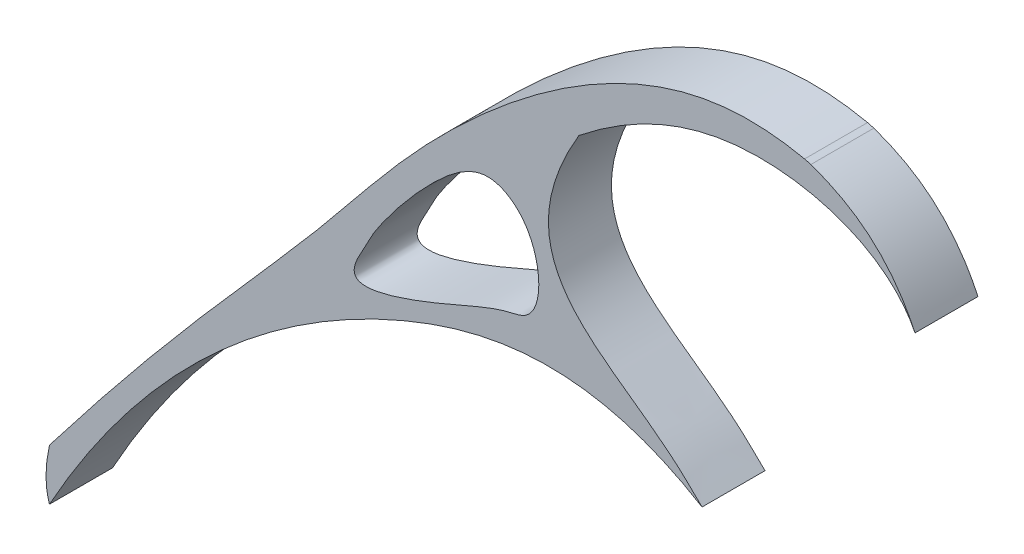
ISO-10303-21;
HEADER;
FILE_DESCRIPTION(('STEP AP214'),'2;1');
FILE_NAME('part.step','',(''),(''),'','','');
FILE_SCHEMA(('AUTOMOTIVE_DESIGN { 1 0 10303 214 1 1 1 1 }'));
ENDSEC;
DATA;
#1=APPLICATION_CONTEXT('core data for automotive mechanical design processes');
#2=APPLICATION_PROTOCOL_DEFINITION('international standard','automotive_design',2000,#1);
#3=PRODUCT_CONTEXT('',#1,'mechanical');
#4=PRODUCT('Part','Part','',(#3));
#5=PRODUCT_RELATED_PRODUCT_CATEGORY('part','',(#4));
#6=PRODUCT_DEFINITION_FORMATION('','',#4);
#7=PRODUCT_DEFINITION_CONTEXT('part definition',#1,'design');
#8=PRODUCT_DEFINITION('design','',#6,#7);
#9=PRODUCT_DEFINITION_SHAPE('','',#8);
#10=(LENGTH_UNIT() NAMED_UNIT(*) SI_UNIT(.MILLI.,.METRE.));
#11=(NAMED_UNIT(*) PLANE_ANGLE_UNIT() SI_UNIT($,.RADIAN.));
#12=(NAMED_UNIT(*) SI_UNIT($,.STERADIAN.) SOLID_ANGLE_UNIT());
#13=UNCERTAINTY_MEASURE_WITH_UNIT(LENGTH_MEASURE(1.E-05),#10,'distance_accuracy_value','');
#14=(GEOMETRIC_REPRESENTATION_CONTEXT(3) GLOBAL_UNCERTAINTY_ASSIGNED_CONTEXT((#13)) GLOBAL_UNIT_ASSIGNED_CONTEXT((#10,
#11,#12)) REPRESENTATION_CONTEXT('',''));
#15=CARTESIAN_POINT('',(0.,0.,0.));
#16=DIRECTION('',(0.,0.,1.));
#17=DIRECTION('',(1.,0.,0.));
#18=AXIS2_PLACEMENT_3D('',#15,#16,#17);
#19=CARTESIAN_POINT('',(2.78157023495851,56.4778755727566,10.));
#20=CARTESIAN_POINT('',(-10.9181701920679,33.3522717841158,10.));
#21=CARTESIAN_POINT('',(9.37374892165481,28.4412942857522,10.));
#22=CARTESIAN_POINT('',(21.2758968242971,16.1363417375195,10.));
#23=CARTESIAN_POINT('',(22.3295883280873,15.1510013995163,10.));
#24=B_SPLINE_CURVE_WITH_KNOTS('',3,(#19,#20,#21,#22,#23),.UNSPECIFIED.,.F.,.F.,(4,1,4),(0.,
0.747546219200271,0.818239289465083),.UNSPECIFIED.);
#25=DIRECTION('',(0.,0.,-1.));
#26=VECTOR('',#25,1.);
#27=SURFACE_OF_LINEAR_EXTRUSION('',#24,#26);
#28=CARTESIAN_POINT('',(2.78157023495851,56.4778755727566,0.));
#29=CARTESIAN_POINT('',(-10.9181701920679,33.3522717841158,0.));
#30=CARTESIAN_POINT('',(9.37374892165481,28.4412942857522,0.));
#31=CARTESIAN_POINT('',(21.2758968242971,16.1363417375195,0.));
#32=CARTESIAN_POINT('',(22.3295883280873,15.1510013995163,0.));
#33=B_SPLINE_CURVE_WITH_KNOTS('',3,(#28,#29,#30,#31,#32),.UNSPECIFIED.,.F.,.F.,(4,1,4),(0.,
0.747546219200271,0.818239289465083),.UNSPECIFIED.);
#34=CARTESIAN_POINT('',(2.78157023495851,56.4778755727566,0.));
#35=VERTEX_POINT('',#34);
#36=CARTESIAN_POINT('',(22.3295883280881,15.1510013995158,0.));
#37=VERTEX_POINT('',#36);
#38=EDGE_CURVE('E192',#35,#37,#33,.T.);
#39=ORIENTED_EDGE('',*,*,#38,.F.);
#40=DIRECTION('',(0.,0.,-1.));
#41=VECTOR('',#40,1.);
#42=CARTESIAN_POINT('',(2.78157023495851,56.4778755727566,10.));
#43=LINE('',#42,#41);
#44=CARTESIAN_POINT('',(2.78157023495851,56.4778755727566,10.));
#45=VERTEX_POINT('',#44);
#46=EDGE_CURVE('E11',#45,#35,#43,.T.);
#47=ORIENTED_EDGE('',*,*,#46,.F.);
#48=CARTESIAN_POINT('',(22.3295883280881,15.1510013995158,10.));
#49=VERTEX_POINT('',#48);
#50=EDGE_CURVE('E169',#45,#49,#24,.T.);
#51=ORIENTED_EDGE('',*,*,#50,.T.);
#52=DIRECTION('',(0.,0.,-1.));
#53=VECTOR('',#52,1.);
#54=CARTESIAN_POINT('',(22.3295883280881,15.1510013995158,10.));
#55=LINE('',#54,#53);
#56=EDGE_CURVE('E83',#49,#37,#55,.T.);
#57=ORIENTED_EDGE('',*,*,#56,.T.);
#58=EDGE_LOOP('',(#39,#47,#51,#57));
#59=FACE_BOUND('',#58,.T.);
#60=ADVANCED_FACE('F34',(#59),#27,.T.);
#61=CARTESIAN_POINT('',(2.78157023495851,56.4778755727566,10.));
#62=CARTESIAN_POINT('',(9.75505173456173,62.0195083270774,10.));
#63=CARTESIAN_POINT('',(27.3967479811564,71.9932714494888,10.));
#64=CARTESIAN_POINT('',(52.444202769317,64.8941986857287,10.));
#65=CARTESIAN_POINT('',(56.5463486284125,55.127707577663,10.));
#66=B_SPLINE_CURVE_WITH_KNOTS('',3,(#61,#62,#63,#64,#65),.UNSPECIFIED.,.F.,.F.,(4,1,4),(0.,
0.46260532823252,1.),.UNSPECIFIED.);
#67=DIRECTION('',(0.,0.,-1.));
#68=VECTOR('',#67,1.);
#69=SURFACE_OF_LINEAR_EXTRUSION('',#66,#68);
#70=CARTESIAN_POINT('',(2.78157023495851,56.4778755727566,0.));
#71=CARTESIAN_POINT('',(9.75505173456173,62.0195083270774,0.));
#72=CARTESIAN_POINT('',(27.3967479811564,71.9932714494888,0.));
#73=CARTESIAN_POINT('',(52.444202769317,64.8941986857287,0.));
#74=CARTESIAN_POINT('',(56.5463486284125,55.127707577663,0.));
#75=B_SPLINE_CURVE_WITH_KNOTS('',3,(#70,#71,#72,#73,#74),.UNSPECIFIED.,.F.,.F.,(4,1,4),(0.,
0.46260532823252,1.),.UNSPECIFIED.);
#76=CARTESIAN_POINT('',(56.1462722876943,56.0026222725463,0.));
#77=VERTEX_POINT('',#76);
#78=EDGE_CURVE('E187',#35,#77,#75,.T.);
#79=ORIENTED_EDGE('',*,*,#78,.T.);
#80=DIRECTION('',(0.,0.,-1.));
#81=VECTOR('',#80,1.);
#82=CARTESIAN_POINT('',(56.1462722876943,56.0026222725463,10.));
#83=LINE('',#82,#81);
#84=CARTESIAN_POINT('',(56.1462722876943,56.0026222725463,10.));
#85=VERTEX_POINT('',#84);
#86=EDGE_CURVE('E43',#85,#77,#83,.T.);
#87=ORIENTED_EDGE('',*,*,#86,.F.);
#88=EDGE_CURVE('E162',#45,#85,#66,.T.);
#89=ORIENTED_EDGE('',*,*,#88,.F.);
#90=ORIENTED_EDGE('',*,*,#46,.T.);
#91=EDGE_LOOP('',(#79,#87,#89,#90));
#92=FACE_BOUND('',#91,.T.);
#93=ADVANCED_FACE('F176',(#92),#69,.F.);
#94=CARTESIAN_POINT('',(39.6095497892832,70.8961174142382,10.));
#95=CARTESIAN_POINT('',(47.0123878353108,68.3178288678129,10.));
#96=CARTESIAN_POINT('',(58.3752557208595,58.4182183450739,10.));
#97=CARTESIAN_POINT('',(62.3747237747644,32.3528735853902,10.));
#98=CARTESIAN_POINT('',(54.3258110881676,23.0431282968841,10.));
#99=CARTESIAN_POINT('',(51.9460569732645,19.5146957271995,10.));
#100=B_SPLINE_CURVE_WITH_KNOTS('',3,(#94,#95,#96,#97,#98,#99),.UNSPECIFIED.,.F.,.F.,(4,1,1,4),
(0.00520266082699301,0.309690794821802,0.684334568619733,0.840119750989101),.UNSPECIFIED.);
#101=DIRECTION('',(0.,0.,-1.));
#102=VECTOR('',#101,1.);
#103=SURFACE_OF_LINEAR_EXTRUSION('',#100,#102);
#104=CARTESIAN_POINT('',(39.6095497892832,70.8961174142382,0.));
#105=CARTESIAN_POINT('',(47.0123878353108,68.3178288678129,0.));
#106=CARTESIAN_POINT('',(58.3752557208595,58.4182183450739,0.));
#107=CARTESIAN_POINT('',(62.3747237747644,32.3528735853902,0.));
#108=CARTESIAN_POINT('',(54.3258110881676,23.0431282968841,0.));
#109=CARTESIAN_POINT('',(51.9460569732645,19.5146957271995,0.));
#110=B_SPLINE_CURVE_WITH_KNOTS('',3,(#104,#105,#106,#107,#108,#109),.UNSPECIFIED.,.F.,.F.,(4,1,
1,4),(0.00520266082699301,0.309690794821802,0.684334568619733,0.840119750989101),.UNSPECIFIED.);
#111=CARTESIAN_POINT('',(39.6095497892832,70.8961174142382,0.));
#112=VERTEX_POINT('',#111);
#113=EDGE_CURVE('E191',#112,#77,#110,.T.);
#114=ORIENTED_EDGE('',*,*,#113,.F.);
#115=DIRECTION('',(0.,0.,-1.));
#116=VECTOR('',#115,1.);
#117=CARTESIAN_POINT('',(39.6095497892832,70.8961174142382,10.));
#118=LINE('',#117,#116);
#119=CARTESIAN_POINT('',(39.6095497892832,70.8961174142382,10.));
#120=VERTEX_POINT('',#119);
#121=EDGE_CURVE('E246',#120,#112,#118,.T.);
#122=ORIENTED_EDGE('',*,*,#121,.F.);
#123=EDGE_CURVE('E153',#120,#85,#100,.T.);
#124=ORIENTED_EDGE('',*,*,#123,.T.);
#125=ORIENTED_EDGE('',*,*,#86,.T.);
#126=EDGE_LOOP('',(#114,#122,#124,#125));
#127=FACE_BOUND('',#126,.T.);
#128=ADVANCED_FACE('F147',(#127),#103,.T.);
#129=CARTESIAN_POINT('',(38.6105936777325,71.1635100115435,10.));
#130=CARTESIAN_POINT('',(39.2609249068528,70.9980648923577,10.));
#131=CARTESIAN_POINT('',(39.6095497892832,70.8961174142382,10.));
#132=B_SPLINE_CURVE_WITH_KNOTS('',2,(#129,#130,#131),.UNSPECIFIED.,.F.,.F.,(3,3),
(0.963854282957486,1.),.UNSPECIFIED.);
#133=DIRECTION('',(0.,0.,-1.));
#134=VECTOR('',#133,1.);
#135=SURFACE_OF_LINEAR_EXTRUSION('',#132,#134);
#136=CARTESIAN_POINT('',(38.6105936777325,71.1635100115435,0.));
#137=CARTESIAN_POINT('',(39.2609249068528,70.9980648923577,0.));
#138=CARTESIAN_POINT('',(39.6095497892832,70.8961174142382,0.));
#139=B_SPLINE_CURVE_WITH_KNOTS('',2,(#136,#137,#138),.UNSPECIFIED.,.F.,.F.,(3,3),
(0.963854282957486,1.),.UNSPECIFIED.);
#140=CARTESIAN_POINT('',(38.6105936777325,71.1635100115435,0.));
#141=VERTEX_POINT('',#140);
#142=EDGE_CURVE('E199',#141,#112,#139,.T.);
#143=ORIENTED_EDGE('',*,*,#142,.F.);
#144=DIRECTION('',(0.,0.,-1.));
#145=VECTOR('',#144,1.);
#146=CARTESIAN_POINT('',(38.6105936777325,71.1635100115435,10.));
#147=LINE('',#146,#145);
#148=CARTESIAN_POINT('',(38.6105936777325,71.1635100115435,10.));
#149=VERTEX_POINT('',#148);
#150=EDGE_CURVE('E115',#149,#141,#147,.T.);
#151=ORIENTED_EDGE('',*,*,#150,.F.);
#152=EDGE_CURVE('E108',#149,#120,#132,.T.);
#153=ORIENTED_EDGE('',*,*,#152,.T.);
#154=ORIENTED_EDGE('',*,*,#121,.T.);
#155=EDGE_LOOP('',(#143,#151,#153,#154));
#156=FACE_BOUND('',#155,.T.);
#157=ADVANCED_FACE('F144',(#156),#135,.T.);
#158=CARTESIAN_POINT('',(38.6106193833234,71.1635034720022,10.));
#159=CARTESIAN_POINT('',(31.4383649206272,72.7031616687764,10.));
#160=CARTESIAN_POINT('',(11.365622353208,71.4785389326488,10.));
#161=CARTESIAN_POINT('',(-20.3274928352755,46.705499202211,10.));
#162=CARTESIAN_POINT('',(-39.7926140741622,20.0589188088602,10.));
#163=CARTESIAN_POINT('',(-61.5718671810812,-2.42004186226086,10.));
#164=CARTESIAN_POINT('',(-81.2929034918169,-28.143886460653,10.));
#165=B_SPLINE_CURVE_WITH_KNOTS('',3,(#158,#159,#160,#161,#162,#163,#164),.UNSPECIFIED.,.F.,.F.,
(4,1,1,1,4),(0.00353171973104316,0.126810531811846,0.380842094758644,0.641524645544449,1.),.UNSPECIFIED.);
#166=DIRECTION('',(0.,0.,-1.));
#167=VECTOR('',#166,1.);
#168=SURFACE_OF_LINEAR_EXTRUSION('',#165,#167);
#169=CARTESIAN_POINT('',(38.6106193833234,71.1635034720022,0.));
#170=CARTESIAN_POINT('',(31.4383649206272,72.7031616687764,0.));
#171=CARTESIAN_POINT('',(11.365622353208,71.4785389326488,0.));
#172=CARTESIAN_POINT('',(-20.3274928352755,46.705499202211,0.));
#173=CARTESIAN_POINT('',(-39.7926140741622,20.0589188088602,0.));
#174=CARTESIAN_POINT('',(-61.5718671810812,-2.42004186226086,0.));
#175=CARTESIAN_POINT('',(-81.2929034918169,-28.143886460653,0.));
#176=B_SPLINE_CURVE_WITH_KNOTS('',3,(#169,#170,#171,#172,#173,#174,#175),.UNSPECIFIED.,.F.,.F.,
(4,1,1,1,4),(0.00353171973104316,0.126810531811846,0.380842094758644,0.641524645544449,1.),.UNSPECIFIED.);
#177=CARTESIAN_POINT('',(-81.2929034918169,-28.143886460653,0.));
#178=VERTEX_POINT('',#177);
#179=EDGE_CURVE('E114',#141,#178,#176,.T.);
#180=ORIENTED_EDGE('',*,*,#179,.T.);
#181=DIRECTION('',(0.,0.,-1.));
#182=VECTOR('',#181,1.);
#183=CARTESIAN_POINT('',(-81.2929034918169,-28.143886460653,10.));
#184=LINE('',#183,#182);
#185=CARTESIAN_POINT('',(-81.2929034918169,-28.143886460653,10.));
#186=VERTEX_POINT('',#185);
#187=EDGE_CURVE('E111',#186,#178,#184,.T.);
#188=ORIENTED_EDGE('',*,*,#187,.F.);
#189=EDGE_CURVE('E100',#149,#186,#165,.T.);
#190=ORIENTED_EDGE('',*,*,#189,.F.);
#191=ORIENTED_EDGE('',*,*,#150,.T.);
#192=EDGE_LOOP('',(#180,#188,#190,#191));
#193=FACE_BOUND('',#192,.T.);
#194=ADVANCED_FACE('F112',(#193),#168,.F.);
#195=CARTESIAN_POINT('',(-81.2929034918169,-28.143886460653,10.));
#196=CARTESIAN_POINT('',(-83.6195609650104,-38.5426791862259,10.));
#197=CARTESIAN_POINT('',(-76.1011504298283,-41.3514457912475,10.));
#198=B_SPLINE_CURVE_WITH_KNOTS('',2,(#195,#196,#197),.UNSPECIFIED.,.F.,.F.,(3,3),(0.,1.),.UNSPECIFIED.);
#199=DIRECTION('',(0.,0.,-1.));
#200=VECTOR('',#199,1.);
#201=SURFACE_OF_LINEAR_EXTRUSION('',#198,#200);
#202=CARTESIAN_POINT('',(-81.2929034918169,-28.143886460653,0.));
#203=CARTESIAN_POINT('',(-83.6195609650104,-38.5426791862259,0.));
#204=CARTESIAN_POINT('',(-76.1011504298283,-41.3514457912475,0.));
#205=B_SPLINE_CURVE_WITH_KNOTS('',2,(#202,#203,#204),.UNSPECIFIED.,.F.,.F.,(3,3),(0.,1.),.UNSPECIFIED.);
#206=CARTESIAN_POINT('',(-81.2929034918262,-36.2783286616256,0.));
#207=VERTEX_POINT('',#206);
#208=EDGE_CURVE('E76',#178,#207,#205,.T.);
#209=ORIENTED_EDGE('',*,*,#208,.T.);
#210=DIRECTION('',(0.,0.,-1.));
#211=VECTOR('',#210,1.);
#212=CARTESIAN_POINT('',(-81.2929034918262,-36.2783286616256,10.));
#213=LINE('',#212,#211);
#214=CARTESIAN_POINT('',(-81.2929034918262,-36.2783286616256,10.));
#215=VERTEX_POINT('',#214);
#216=EDGE_CURVE('E116',#215,#207,#213,.T.);
#217=ORIENTED_EDGE('',*,*,#216,.F.);
#218=EDGE_CURVE('E105',#186,#215,#198,.T.);
#219=ORIENTED_EDGE('',*,*,#218,.F.);
#220=ORIENTED_EDGE('',*,*,#187,.T.);
#221=EDGE_LOOP('',(#209,#217,#219,#220));
#222=FACE_BOUND('',#221,.T.);
#223=ADVANCED_FACE('F118',(#222),#201,.F.);
#224=CARTESIAN_POINT('',(-81.2929034918168,-36.278328661653,10.));
#225=CARTESIAN_POINT('',(-67.8471865122681,-12.0192188338044,10.));
#226=CARTESIAN_POINT('',(-36.8817974497271,18.832507342674,10.));
#227=CARTESIAN_POINT('',(6.05401980057526,26.1158647437927,10.));
#228=CARTESIAN_POINT('',(24.5041322410582,13.7599801557885,10.));
#229=B_SPLINE_CURVE_WITH_KNOTS('',3,(#224,#225,#226,#227,#228),.UNSPECIFIED.,.F.,.F.,(4,1,4),
(0.,0.593504623180425,0.977243459732475),.UNSPECIFIED.);
#230=DIRECTION('',(0.,0.,-1.));
#231=VECTOR('',#230,1.);
#232=SURFACE_OF_LINEAR_EXTRUSION('',#229,#231);
#233=CARTESIAN_POINT('',(-81.2929034918168,-36.278328661653,0.));
#234=CARTESIAN_POINT('',(-67.8471865122681,-12.0192188338044,0.));
#235=CARTESIAN_POINT('',(-36.8817974497271,18.832507342674,0.));
#236=CARTESIAN_POINT('',(6.05401980057526,26.1158647437927,0.));
#237=CARTESIAN_POINT('',(24.5041322410582,13.7599801557885,0.));
#238=B_SPLINE_CURVE_WITH_KNOTS('',3,(#233,#234,#235,#236,#237),.UNSPECIFIED.,.F.,.F.,(4,1,4),
(0.,0.593504623180425,0.977243459732475),.UNSPECIFIED.);
#239=EDGE_CURVE('E225',#207,#37,#238,.T.);
#240=ORIENTED_EDGE('',*,*,#239,.T.);
#241=ORIENTED_EDGE('',*,*,#56,.F.);
#242=EDGE_CURVE('E51',#215,#49,#229,.T.);
#243=ORIENTED_EDGE('',*,*,#242,.F.);
#244=ORIENTED_EDGE('',*,*,#216,.T.);
#245=EDGE_LOOP('',(#240,#241,#243,#244));
#246=FACE_BOUND('',#245,.T.);
#247=ADVANCED_FACE('F140',(#246),#232,.F.);
#248=CARTESIAN_POINT('',(-28.3902423523311,28.8973090137237,10.));
#249=CARTESIAN_POINT('',(-26.5713886592162,31.4632090979087,10.));
#250=CARTESIAN_POINT('',(-20.9532124526466,38.7162418127527,10.));
#251=CARTESIAN_POINT('',(-11.8905383457723,45.2867117471239,10.));
#252=CARTESIAN_POINT('',(-3.10016941693719,39.2693637235746,10.));
#253=CARTESIAN_POINT('',(-2.78927548090347,27.4293616295983,10.));
#254=CARTESIAN_POINT('',(-9.74025662267519,26.5320450092498,10.));
#255=CARTESIAN_POINT('',(-38.710808990714,13.4203526333964,10.));
#256=CARTESIAN_POINT('',(-31.5508679983338,22.6874814932975,10.));
#257=CARTESIAN_POINT('',(-30.056508931191,26.5466671940129,10.));
#258=CARTESIAN_POINT('',(-28.3902423523311,28.8973090137237,10.));
#259=B_SPLINE_CURVE_WITH_KNOTS('',3,(#248,#249,#250,#251,#252,#253,#254,#255,#256,#257,#258),
.UNSPECIFIED.,.T.,.F.,(4,1,1,1,1,1,1,1,4),(0.,0.120347822003334,0.195890843614702,
0.256651724543317,0.359848027807498,0.390374162528509,0.443364198438644,0.889748386908841,1.),.UNSPECIFIED.);
#260=DIRECTION('',(0.,0.,-1.));
#261=VECTOR('',#260,1.);
#262=SURFACE_OF_LINEAR_EXTRUSION('',#259,#261);
#263=CARTESIAN_POINT('',(-28.3902423523311,28.8973090137237,10.));
#264=VERTEX_POINT('',#263);
#265=EDGE_CURVE('E120',#264,#264,#259,.T.);
#266=ORIENTED_EDGE('',*,*,#265,.F.);
#267=EDGE_LOOP('',(#266));
#268=FACE_BOUND('',#267,.T.);
#269=CARTESIAN_POINT('',(-28.3902423523311,28.8973090137237,0.));
#270=CARTESIAN_POINT('',(-26.5713886592162,31.4632090979087,0.));
#271=CARTESIAN_POINT('',(-20.9532124526466,38.7162418127527,0.));
#272=CARTESIAN_POINT('',(-11.8905383457723,45.2867117471239,0.));
#273=CARTESIAN_POINT('',(-3.10016941693719,39.2693637235746,0.));
#274=CARTESIAN_POINT('',(-2.78927548090347,27.4293616295983,0.));
#275=CARTESIAN_POINT('',(-9.74025662267519,26.5320450092498,0.));
#276=CARTESIAN_POINT('',(-38.710808990714,13.4203526333964,0.));
#277=CARTESIAN_POINT('',(-31.5508679983338,22.6874814932975,0.));
#278=CARTESIAN_POINT('',(-30.056508931191,26.5466671940129,0.));
#279=CARTESIAN_POINT('',(-28.3902423523311,28.8973090137237,0.));
#280=B_SPLINE_CURVE_WITH_KNOTS('',3,(#269,#270,#271,#272,#273,#274,#275,#276,#277,#278,#279),
.UNSPECIFIED.,.T.,.F.,(4,1,1,1,1,1,1,1,4),(0.,0.120347822003334,0.195890843614702,
0.256651724543317,0.359848027807498,0.390374162528509,0.443364198438644,0.889748386908841,1.),.UNSPECIFIED.);
#281=CARTESIAN_POINT('',(-28.3902423523311,28.8973090137237,0.));
#282=VERTEX_POINT('',#281);
#283=EDGE_CURVE('E232',#282,#282,#280,.T.);
#284=ORIENTED_EDGE('',*,*,#283,.T.);
#285=EDGE_LOOP('',(#284));
#286=FACE_BOUND('',#285,.T.);
#287=ADVANCED_FACE('F261',(#268,#286),#262,.F.);
#288=CARTESIAN_POINT('',(0.,0.,10.));
#289=DIRECTION('',(0.,0.,1.));
#290=DIRECTION('',(1.,0.,0.));
#291=AXIS2_PLACEMENT_3D('',#288,#289,#290);
#292=PLANE('',#291);
#293=ORIENTED_EDGE('',*,*,#50,.F.);
#294=ORIENTED_EDGE('',*,*,#88,.T.);
#295=ORIENTED_EDGE('',*,*,#123,.F.);
#296=ORIENTED_EDGE('',*,*,#152,.F.);
#297=ORIENTED_EDGE('',*,*,#189,.T.);
#298=ORIENTED_EDGE('',*,*,#218,.T.);
#299=ORIENTED_EDGE('',*,*,#242,.T.);
#300=EDGE_LOOP('',(#293,#294,#295,#296,#297,#298,#299));
#301=FACE_BOUND('',#300,.T.);
#302=ORIENTED_EDGE('',*,*,#265,.T.);
#303=EDGE_LOOP('',(#302));
#304=FACE_BOUND('',#303,.T.);
#305=ADVANCED_FACE('F102',(#301,#304),#292,.T.);
#306=CARTESIAN_POINT('',(0.,0.,0.));
#307=DIRECTION('',(0.,0.,1.));
#308=DIRECTION('',(1.,0.,0.));
#309=AXIS2_PLACEMENT_3D('',#306,#307,#308);
#310=PLANE('',#309);
#311=ORIENTED_EDGE('',*,*,#38,.T.);
#312=ORIENTED_EDGE('',*,*,#239,.F.);
#313=ORIENTED_EDGE('',*,*,#208,.F.);
#314=ORIENTED_EDGE('',*,*,#179,.F.);
#315=ORIENTED_EDGE('',*,*,#142,.T.);
#316=ORIENTED_EDGE('',*,*,#113,.T.);
#317=ORIENTED_EDGE('',*,*,#78,.F.);
#318=EDGE_LOOP('',(#311,#312,#313,#314,#315,#316,#317));
#319=FACE_BOUND('',#318,.T.);
#320=ORIENTED_EDGE('',*,*,#283,.F.);
#321=EDGE_LOOP('',(#320));
#322=FACE_BOUND('',#321,.T.);
#323=ADVANCED_FACE('F196',(#319,#322),#310,.F.);
#324=CLOSED_SHELL('',(#60,#93,#128,#157,#194,#223,#247,#287,#305,#323));
#325=MANIFOLD_SOLID_BREP('B2',#324);
#326=ADVANCED_BREP_SHAPE_REPRESENTATION('',(#18,#325),#14);
#327=SHAPE_DEFINITION_REPRESENTATION(#9,#326);
ENDSEC;
END-ISO-10303-21;
